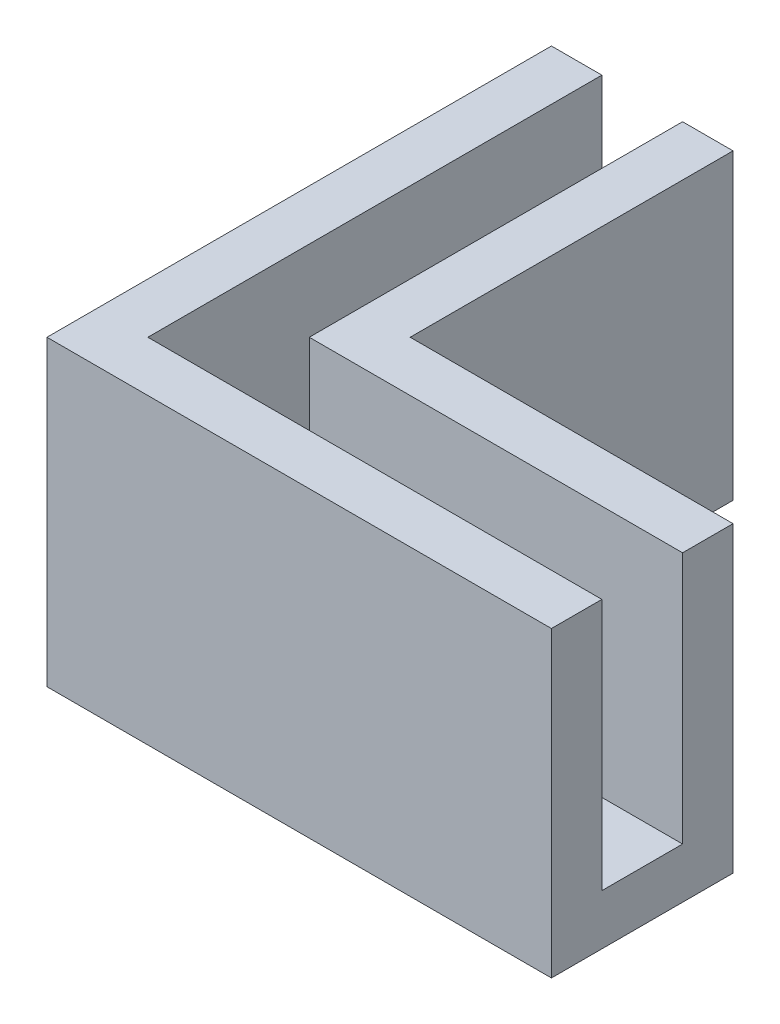
ISO-10303-21;
HEADER;
FILE_DESCRIPTION(('STEP AP214'),'2;1');
FILE_NAME('part.step','',(''),(''),'','','');
FILE_SCHEMA(('AUTOMOTIVE_DESIGN { 1 0 10303 214 1 1 1 1 }'));
ENDSEC;
DATA;
#1=APPLICATION_CONTEXT('core data for automotive mechanical design processes');
#2=APPLICATION_PROTOCOL_DEFINITION('international standard','automotive_design',2000,#1);
#3=PRODUCT_CONTEXT('',#1,'mechanical');
#4=PRODUCT('Part','Part','',(#3));
#5=PRODUCT_RELATED_PRODUCT_CATEGORY('part','',(#4));
#6=PRODUCT_DEFINITION_FORMATION('','',#4);
#7=PRODUCT_DEFINITION_CONTEXT('part definition',#1,'design');
#8=PRODUCT_DEFINITION('design','',#6,#7);
#9=PRODUCT_DEFINITION_SHAPE('','',#8);
#10=(LENGTH_UNIT() NAMED_UNIT(*) SI_UNIT(.MILLI.,.METRE.));
#11=(NAMED_UNIT(*) PLANE_ANGLE_UNIT() SI_UNIT($,.RADIAN.));
#12=(NAMED_UNIT(*) SI_UNIT($,.STERADIAN.) SOLID_ANGLE_UNIT());
#13=UNCERTAINTY_MEASURE_WITH_UNIT(LENGTH_MEASURE(1.E-05),#10,'distance_accuracy_value','');
#14=(GEOMETRIC_REPRESENTATION_CONTEXT(3) GLOBAL_UNCERTAINTY_ASSIGNED_CONTEXT((#13)) GLOBAL_UNIT_ASSIGNED_CONTEXT((#10,
#11,#12)) REPRESENTATION_CONTEXT('',''));
#15=CARTESIAN_POINT('',(0.,0.,0.));
#16=DIRECTION('',(0.,0.,1.));
#17=DIRECTION('',(1.,0.,0.));
#18=AXIS2_PLACEMENT_3D('',#15,#16,#17);
#19=CARTESIAN_POINT('',(50.,5.,1.5419764230905E-13));
#20=DIRECTION('',(-1.,0.,0.));
#21=DIRECTION('',(0.,0.,1.));
#22=AXIS2_PLACEMENT_3D('',#19,#20,#21);
#23=PLANE('',#22);
#24=DIRECTION('',(0.,0.,-1.));
#25=VECTOR('',#24,1.);
#26=CARTESIAN_POINT('',(50.,0.,1.5419764230905E-13));
#27=LINE('',#26,#25);
#28=CARTESIAN_POINT('',(50.,0.,1.66533452958502E-13));
#29=VERTEX_POINT('',#28);
#30=CARTESIAN_POINT('',(50.0000000000001,0.,-17.9999999999998));
#31=VERTEX_POINT('',#30);
#32=EDGE_CURVE('E249',#29,#31,#27,.T.);
#33=ORIENTED_EDGE('',*,*,#32,.T.);
#34=DIRECTION('',(0.,-1.,0.));
#35=VECTOR('',#34,1.);
#36=CARTESIAN_POINT('',(50.0000000000001,30.,-17.9999999999998));
#37=LINE('',#36,#35);
#38=CARTESIAN_POINT('',(50.0000000000001,30.,-17.9999999999998));
#39=VERTEX_POINT('',#38);
#40=EDGE_CURVE('E176',#39,#31,#37,.T.);
#41=ORIENTED_EDGE('',*,*,#40,.F.);
#42=DIRECTION('',(0.,0.,-1.));
#43=VECTOR('',#42,1.);
#44=CARTESIAN_POINT('',(50.,30.,1.5419764230905E-13));
#45=LINE('',#44,#43);
#46=CARTESIAN_POINT('',(50.,30.,-12.9999999999999));
#47=VERTEX_POINT('',#46);
#48=EDGE_CURVE('E179',#47,#39,#45,.T.);
#49=ORIENTED_EDGE('',*,*,#48,.F.);
#50=DIRECTION('',(0.,-1.,0.));
#51=VECTOR('',#50,1.);
#52=CARTESIAN_POINT('',(50.,30.,-12.9999999999999));
#53=LINE('',#52,#51);
#54=CARTESIAN_POINT('',(50.,5.,-12.9999999999999));
#55=VERTEX_POINT('',#54);
#56=EDGE_CURVE('E164',#47,#55,#53,.T.);
#57=ORIENTED_EDGE('',*,*,#56,.T.);
#58=DIRECTION('',(0.,0.,-1.));
#59=VECTOR('',#58,1.);
#60=CARTESIAN_POINT('',(50.,5.,1.5419764230905E-13));
#61=LINE('',#60,#59);
#62=CARTESIAN_POINT('',(50.,5.,-4.99999999999991));
#63=VERTEX_POINT('',#62);
#64=EDGE_CURVE('E253',#63,#55,#61,.T.);
#65=ORIENTED_EDGE('',*,*,#64,.F.);
#66=DIRECTION('',(0.,-1.,0.));
#67=VECTOR('',#66,1.);
#68=CARTESIAN_POINT('',(50.,30.,-4.99999999999991));
#69=LINE('',#68,#67);
#70=CARTESIAN_POINT('',(50.,30.,-4.99999999999991));
#71=VERTEX_POINT('',#70);
#72=EDGE_CURVE('E91',#71,#63,#69,.T.);
#73=ORIENTED_EDGE('',*,*,#72,.F.);
#74=DIRECTION('',(0.,0.,-1.));
#75=VECTOR('',#74,1.);
#76=CARTESIAN_POINT('',(50.,30.,1.5419764230905E-13));
#77=LINE('',#76,#75);
#78=CARTESIAN_POINT('',(50.,30.,1.66533452958502E-13));
#79=VERTEX_POINT('',#78);
#80=EDGE_CURVE('E229',#79,#71,#77,.T.);
#81=ORIENTED_EDGE('',*,*,#80,.F.);
#82=DIRECTION('',(0.,-1.,0.));
#83=VECTOR('',#82,1.);
#84=CARTESIAN_POINT('',(50.,30.,1.66533452958502E-13));
#85=LINE('',#84,#83);
#86=EDGE_CURVE('E236',#79,#29,#85,.T.);
#87=ORIENTED_EDGE('',*,*,#86,.T.);
#88=EDGE_LOOP('',(#33,#41,#49,#57,#65,#73,#81,#87));
#89=FACE_BOUND('',#88,.T.);
#90=ADVANCED_FACE('F75',(#89),#23,.F.);
#91=CARTESIAN_POINT('',(0.,5.,-50.));
#92=DIRECTION('',(0.,0.,-1.));
#93=DIRECTION('',(-1.,0.,0.));
#94=AXIS2_PLACEMENT_3D('',#91,#92,#93);
#95=PLANE('',#94);
#96=DIRECTION('',(1.,0.,0.));
#97=VECTOR('',#96,1.);
#98=CARTESIAN_POINT('',(0.,0.,-50.));
#99=LINE('',#98,#97);
#100=CARTESIAN_POINT('',(0.,0.,-50.));
#101=VERTEX_POINT('',#100);
#102=CARTESIAN_POINT('',(18.,0.,-50.));
#103=VERTEX_POINT('',#102);
#104=EDGE_CURVE('E78',#101,#103,#99,.T.);
#105=ORIENTED_EDGE('',*,*,#104,.F.);
#106=DIRECTION('',(0.,-1.,0.));
#107=VECTOR('',#106,1.);
#108=CARTESIAN_POINT('',(0.,30.,-50.));
#109=LINE('',#108,#107);
#110=CARTESIAN_POINT('',(0.,30.,-50.));
#111=VERTEX_POINT('',#110);
#112=EDGE_CURVE('E241',#111,#101,#109,.T.);
#113=ORIENTED_EDGE('',*,*,#112,.F.);
#114=DIRECTION('',(1.,0.,0.));
#115=VECTOR('',#114,1.);
#116=CARTESIAN_POINT('',(0.,30.,-50.));
#117=LINE('',#116,#115);
#118=CARTESIAN_POINT('',(5.,30.,-50.));
#119=VERTEX_POINT('',#118);
#120=EDGE_CURVE('E221',#111,#119,#117,.T.);
#121=ORIENTED_EDGE('',*,*,#120,.T.);
#122=DIRECTION('',(0.,-1.,0.));
#123=VECTOR('',#122,1.);
#124=CARTESIAN_POINT('',(5.,30.,-50.));
#125=LINE('',#124,#123);
#126=CARTESIAN_POINT('',(5.,5.,-50.));
#127=VERTEX_POINT('',#126);
#128=EDGE_CURVE('E244',#119,#127,#125,.T.);
#129=ORIENTED_EDGE('',*,*,#128,.T.);
#130=DIRECTION('',(1.,0.,0.));
#131=VECTOR('',#130,1.);
#132=CARTESIAN_POINT('',(0.,5.,-50.));
#133=LINE('',#132,#131);
#134=CARTESIAN_POINT('',(13.,5.,-50.));
#135=VERTEX_POINT('',#134);
#136=EDGE_CURVE('E12',#127,#135,#133,.T.);
#137=ORIENTED_EDGE('',*,*,#136,.T.);
#138=DIRECTION('',(0.,-1.,0.));
#139=VECTOR('',#138,1.);
#140=CARTESIAN_POINT('',(13.,30.,-50.));
#141=LINE('',#140,#139);
#142=CARTESIAN_POINT('',(13.,30.,-50.));
#143=VERTEX_POINT('',#142);
#144=EDGE_CURVE('E208',#143,#135,#141,.T.);
#145=ORIENTED_EDGE('',*,*,#144,.F.);
#146=DIRECTION('',(1.,0.,0.));
#147=VECTOR('',#146,1.);
#148=CARTESIAN_POINT('',(0.,30.,-50.));
#149=LINE('',#148,#147);
#150=CARTESIAN_POINT('',(18.,30.,-50.));
#151=VERTEX_POINT('',#150);
#152=EDGE_CURVE('E200',#143,#151,#149,.T.);
#153=ORIENTED_EDGE('',*,*,#152,.T.);
#154=DIRECTION('',(0.,-1.,0.));
#155=VECTOR('',#154,1.);
#156=CARTESIAN_POINT('',(18.,30.,-50.));
#157=LINE('',#156,#155);
#158=EDGE_CURVE('E210',#151,#103,#157,.T.);
#159=ORIENTED_EDGE('',*,*,#158,.T.);
#160=EDGE_LOOP('',(#105,#113,#121,#129,#137,#145,#153,#159));
#161=FACE_BOUND('',#160,.T.);
#162=ADVANCED_FACE('F263',(#161),#95,.T.);
#163=CARTESIAN_POINT('',(0.,5.,0.));
#164=DIRECTION('',(0.,1.,0.));
#165=DIRECTION('',(0.,0.,1.));
#166=AXIS2_PLACEMENT_3D('',#163,#164,#165);
#167=PLANE('',#166);
#168=DIRECTION('',(0.,0.,-1.));
#169=VECTOR('',#168,1.);
#170=CARTESIAN_POINT('',(5.,5.,0.));
#171=LINE('',#170,#169);
#172=CARTESIAN_POINT('',(5.,5.,-4.99999999999998));
#173=VERTEX_POINT('',#172);
#174=EDGE_CURVE('E250',#173,#127,#171,.T.);
#175=ORIENTED_EDGE('',*,*,#174,.F.);
#176=DIRECTION('',(1.,0.,0.));
#177=VECTOR('',#176,1.);
#178=CARTESIAN_POINT('',(0.,5.,-5.));
#179=LINE('',#178,#177);
#180=EDGE_CURVE('E95',#173,#63,#179,.T.);
#181=ORIENTED_EDGE('',*,*,#180,.T.);
#182=ORIENTED_EDGE('',*,*,#64,.T.);
#183=DIRECTION('',(-1.,0.,0.));
#184=VECTOR('',#183,1.);
#185=CARTESIAN_POINT('',(0.,5.,-13.));
#186=LINE('',#185,#184);
#187=CARTESIAN_POINT('',(13.,5.,-13.));
#188=VERTEX_POINT('',#187);
#189=EDGE_CURVE('E171',#55,#188,#186,.T.);
#190=ORIENTED_EDGE('',*,*,#189,.T.);
#191=DIRECTION('',(0.,0.,1.));
#192=VECTOR('',#191,1.);
#193=CARTESIAN_POINT('',(13.,5.,0.));
#194=LINE('',#193,#192);
#195=EDGE_CURVE('E83',#135,#188,#194,.T.);
#196=ORIENTED_EDGE('',*,*,#195,.F.);
#197=ORIENTED_EDGE('',*,*,#136,.F.);
#198=EDGE_LOOP('',(#175,#181,#182,#190,#196,#197));
#199=FACE_BOUND('',#198,.T.);
#200=ADVANCED_FACE('F289',(#199),#167,.T.);
#201=CARTESIAN_POINT('',(0.,0.,0.));
#202=DIRECTION('',(0.,1.,0.));
#203=DIRECTION('',(0.,0.,1.));
#204=AXIS2_PLACEMENT_3D('',#201,#202,#203);
#205=PLANE('',#204);
#206=ORIENTED_EDGE('',*,*,#32,.F.);
#207=DIRECTION('',(1.,0.,0.));
#208=VECTOR('',#207,1.);
#209=CARTESIAN_POINT('',(0.,0.,0.));
#210=LINE('',#209,#208);
#211=CARTESIAN_POINT('',(0.,0.,0.));
#212=VERTEX_POINT('',#211);
#213=EDGE_CURVE('E219',#212,#29,#210,.T.);
#214=ORIENTED_EDGE('',*,*,#213,.F.);
#215=DIRECTION('',(0.,0.,-1.));
#216=VECTOR('',#215,1.);
#217=CARTESIAN_POINT('',(0.,0.,0.));
#218=LINE('',#217,#216);
#219=EDGE_CURVE('E175',#212,#101,#218,.T.);
#220=ORIENTED_EDGE('',*,*,#219,.T.);
#221=ORIENTED_EDGE('',*,*,#104,.T.);
#222=DIRECTION('',(0.,0.,1.));
#223=VECTOR('',#222,1.);
#224=CARTESIAN_POINT('',(18.,0.,0.));
#225=LINE('',#224,#223);
#226=CARTESIAN_POINT('',(18.,0.,-17.9999999999999));
#227=VERTEX_POINT('',#226);
#228=EDGE_CURVE('E190',#103,#227,#225,.T.);
#229=ORIENTED_EDGE('',*,*,#228,.T.);
#230=DIRECTION('',(-1.,0.,0.));
#231=VECTOR('',#230,1.);
#232=CARTESIAN_POINT('',(0.,0.,-18.));
#233=LINE('',#232,#231);
#234=EDGE_CURVE('E193',#31,#227,#233,.T.);
#235=ORIENTED_EDGE('',*,*,#234,.F.);
#236=EDGE_LOOP('',(#206,#214,#220,#221,#229,#235));
#237=FACE_BOUND('',#236,.T.);
#238=ADVANCED_FACE('F257',(#237),#205,.F.);
#239=CARTESIAN_POINT('',(0.,30.,-5.));
#240=DIRECTION('',(0.,0.,-1.));
#241=DIRECTION('',(-1.,0.,0.));
#242=AXIS2_PLACEMENT_3D('',#239,#240,#241);
#243=PLANE('',#242);
#244=ORIENTED_EDGE('',*,*,#72,.T.);
#245=ORIENTED_EDGE('',*,*,#180,.F.);
#246=DIRECTION('',(0.,-1.,0.));
#247=VECTOR('',#246,1.);
#248=CARTESIAN_POINT('',(5.,30.,-4.99999999999998));
#249=LINE('',#248,#247);
#250=CARTESIAN_POINT('',(5.,30.,-4.99999999999998));
#251=VERTEX_POINT('',#250);
#252=EDGE_CURVE('E247',#251,#173,#249,.T.);
#253=ORIENTED_EDGE('',*,*,#252,.F.);
#254=DIRECTION('',(1.,0.,0.));
#255=VECTOR('',#254,1.);
#256=CARTESIAN_POINT('',(0.,30.,-5.));
#257=LINE('',#256,#255);
#258=EDGE_CURVE('E216',#251,#71,#257,.T.);
#259=ORIENTED_EDGE('',*,*,#258,.T.);
#260=EDGE_LOOP('',(#244,#245,#253,#259));
#261=FACE_BOUND('',#260,.T.);
#262=ADVANCED_FACE('F310',(#261),#243,.T.);
#263=CARTESIAN_POINT('',(5.,30.,0.));
#264=DIRECTION('',(-1.,0.,0.));
#265=DIRECTION('',(0.,0.,1.));
#266=AXIS2_PLACEMENT_3D('',#263,#264,#265);
#267=PLANE('',#266);
#268=ORIENTED_EDGE('',*,*,#174,.T.);
#269=ORIENTED_EDGE('',*,*,#128,.F.);
#270=DIRECTION('',(0.,0.,-1.));
#271=VECTOR('',#270,1.);
#272=CARTESIAN_POINT('',(5.,30.,0.));
#273=LINE('',#272,#271);
#274=EDGE_CURVE('E218',#251,#119,#273,.T.);
#275=ORIENTED_EDGE('',*,*,#274,.F.);
#276=ORIENTED_EDGE('',*,*,#252,.T.);
#277=EDGE_LOOP('',(#268,#269,#275,#276));
#278=FACE_BOUND('',#277,.T.);
#279=ADVANCED_FACE('F314',(#278),#267,.F.);
#280=CARTESIAN_POINT('',(0.,30.,0.));
#281=DIRECTION('',(-1.,0.,0.));
#282=DIRECTION('',(0.,0.,1.));
#283=AXIS2_PLACEMENT_3D('',#280,#281,#282);
#284=PLANE('',#283);
#285=ORIENTED_EDGE('',*,*,#219,.F.);
#286=DIRECTION('',(0.,-1.,0.));
#287=VECTOR('',#286,1.);
#288=CARTESIAN_POINT('',(0.,30.,0.));
#289=LINE('',#288,#287);
#290=CARTESIAN_POINT('',(0.,30.,0.));
#291=VERTEX_POINT('',#290);
#292=EDGE_CURVE('E239',#291,#212,#289,.T.);
#293=ORIENTED_EDGE('',*,*,#292,.F.);
#294=DIRECTION('',(0.,0.,-1.));
#295=VECTOR('',#294,1.);
#296=CARTESIAN_POINT('',(0.,30.,0.));
#297=LINE('',#296,#295);
#298=EDGE_CURVE('E224',#291,#111,#297,.T.);
#299=ORIENTED_EDGE('',*,*,#298,.T.);
#300=ORIENTED_EDGE('',*,*,#112,.T.);
#301=EDGE_LOOP('',(#285,#293,#299,#300));
#302=FACE_BOUND('',#301,.T.);
#303=ADVANCED_FACE('F281',(#302),#284,.T.);
#304=CARTESIAN_POINT('',(0.,30.,0.));
#305=DIRECTION('',(0.,0.,-1.));
#306=DIRECTION('',(-1.,0.,0.));
#307=AXIS2_PLACEMENT_3D('',#304,#305,#306);
#308=PLANE('',#307);
#309=ORIENTED_EDGE('',*,*,#213,.T.);
#310=ORIENTED_EDGE('',*,*,#86,.F.);
#311=DIRECTION('',(1.,0.,0.));
#312=VECTOR('',#311,1.);
#313=CARTESIAN_POINT('',(0.,30.,0.));
#314=LINE('',#313,#312);
#315=EDGE_CURVE('E227',#291,#79,#314,.T.);
#316=ORIENTED_EDGE('',*,*,#315,.F.);
#317=ORIENTED_EDGE('',*,*,#292,.T.);
#318=EDGE_LOOP('',(#309,#310,#316,#317));
#319=FACE_BOUND('',#318,.T.);
#320=ADVANCED_FACE('F272',(#319),#308,.F.);
#321=CARTESIAN_POINT('',(0.,30.,0.));
#322=DIRECTION('',(0.,1.,0.));
#323=DIRECTION('',(0.,0.,1.));
#324=AXIS2_PLACEMENT_3D('',#321,#322,#323);
#325=PLANE('',#324);
#326=ORIENTED_EDGE('',*,*,#258,.F.);
#327=ORIENTED_EDGE('',*,*,#274,.T.);
#328=ORIENTED_EDGE('',*,*,#120,.F.);
#329=ORIENTED_EDGE('',*,*,#298,.F.);
#330=ORIENTED_EDGE('',*,*,#315,.T.);
#331=ORIENTED_EDGE('',*,*,#80,.T.);
#332=EDGE_LOOP('',(#326,#327,#328,#329,#330,#331));
#333=FACE_BOUND('',#332,.T.);
#334=ADVANCED_FACE('F277',(#333),#325,.T.);
#335=CARTESIAN_POINT('',(0.,30.,-13.));
#336=DIRECTION('',(0.,0.,1.));
#337=DIRECTION('',(1.,0.,0.));
#338=AXIS2_PLACEMENT_3D('',#335,#336,#337);
#339=PLANE('',#338);
#340=DIRECTION('',(0.,-1.,0.));
#341=VECTOR('',#340,1.);
#342=CARTESIAN_POINT('',(13.,30.,-13.));
#343=LINE('',#342,#341);
#344=CARTESIAN_POINT('',(13.,30.,-13.));
#345=VERTEX_POINT('',#344);
#346=EDGE_CURVE('E204',#345,#188,#343,.T.);
#347=ORIENTED_EDGE('',*,*,#346,.T.);
#348=ORIENTED_EDGE('',*,*,#189,.F.);
#349=ORIENTED_EDGE('',*,*,#56,.F.);
#350=DIRECTION('',(-1.,0.,0.));
#351=VECTOR('',#350,1.);
#352=CARTESIAN_POINT('',(0.,30.,-13.));
#353=LINE('',#352,#351);
#354=EDGE_CURVE('E169',#47,#345,#353,.T.);
#355=ORIENTED_EDGE('',*,*,#354,.T.);
#356=EDGE_LOOP('',(#347,#348,#349,#355));
#357=FACE_BOUND('',#356,.T.);
#358=ADVANCED_FACE('F167',(#357),#339,.T.);
#359=CARTESIAN_POINT('',(0.,30.,-18.));
#360=DIRECTION('',(0.,0.,1.));
#361=DIRECTION('',(1.,0.,0.));
#362=AXIS2_PLACEMENT_3D('',#359,#360,#361);
#363=PLANE('',#362);
#364=ORIENTED_EDGE('',*,*,#234,.T.);
#365=DIRECTION('',(0.,-1.,0.));
#366=VECTOR('',#365,1.);
#367=CARTESIAN_POINT('',(18.,30.,-17.9999999999999));
#368=LINE('',#367,#366);
#369=CARTESIAN_POINT('',(18.,30.,-17.9999999999999));
#370=VERTEX_POINT('',#369);
#371=EDGE_CURVE('E213',#370,#227,#368,.T.);
#372=ORIENTED_EDGE('',*,*,#371,.F.);
#373=DIRECTION('',(-1.,0.,0.));
#374=VECTOR('',#373,1.);
#375=CARTESIAN_POINT('',(0.,30.,-18.));
#376=LINE('',#375,#374);
#377=EDGE_CURVE('E183',#39,#370,#376,.T.);
#378=ORIENTED_EDGE('',*,*,#377,.F.);
#379=ORIENTED_EDGE('',*,*,#40,.T.);
#380=EDGE_LOOP('',(#364,#372,#378,#379));
#381=FACE_BOUND('',#380,.T.);
#382=ADVANCED_FACE('F269',(#381),#363,.F.);
#383=CARTESIAN_POINT('',(18.,30.,0.));
#384=DIRECTION('',(1.,0.,0.));
#385=DIRECTION('',(0.,0.,-1.));
#386=AXIS2_PLACEMENT_3D('',#383,#384,#385);
#387=PLANE('',#386);
#388=ORIENTED_EDGE('',*,*,#228,.F.);
#389=ORIENTED_EDGE('',*,*,#158,.F.);
#390=DIRECTION('',(0.,0.,1.));
#391=VECTOR('',#390,1.);
#392=CARTESIAN_POINT('',(18.,30.,0.));
#393=LINE('',#392,#391);
#394=EDGE_CURVE('E197',#151,#370,#393,.T.);
#395=ORIENTED_EDGE('',*,*,#394,.T.);
#396=ORIENTED_EDGE('',*,*,#371,.T.);
#397=EDGE_LOOP('',(#388,#389,#395,#396));
#398=FACE_BOUND('',#397,.T.);
#399=ADVANCED_FACE('F266',(#398),#387,.T.);
#400=CARTESIAN_POINT('',(13.,30.,0.));
#401=DIRECTION('',(1.,0.,0.));
#402=DIRECTION('',(0.,0.,-1.));
#403=AXIS2_PLACEMENT_3D('',#400,#401,#402);
#404=PLANE('',#403);
#405=ORIENTED_EDGE('',*,*,#195,.T.);
#406=ORIENTED_EDGE('',*,*,#346,.F.);
#407=DIRECTION('',(0.,0.,1.));
#408=VECTOR('',#407,1.);
#409=CARTESIAN_POINT('',(13.,30.,0.));
#410=LINE('',#409,#408);
#411=EDGE_CURVE('E188',#143,#345,#410,.T.);
#412=ORIENTED_EDGE('',*,*,#411,.F.);
#413=ORIENTED_EDGE('',*,*,#144,.T.);
#414=EDGE_LOOP('',(#405,#406,#412,#413));
#415=FACE_BOUND('',#414,.T.);
#416=ADVANCED_FACE('F291',(#415),#404,.F.);
#417=CARTESIAN_POINT('',(0.,30.,0.));
#418=DIRECTION('',(0.,1.,0.));
#419=DIRECTION('',(0.,0.,1.));
#420=AXIS2_PLACEMENT_3D('',#417,#418,#419);
#421=PLANE('',#420);
#422=ORIENTED_EDGE('',*,*,#354,.F.);
#423=ORIENTED_EDGE('',*,*,#48,.T.);
#424=ORIENTED_EDGE('',*,*,#377,.T.);
#425=ORIENTED_EDGE('',*,*,#394,.F.);
#426=ORIENTED_EDGE('',*,*,#152,.F.);
#427=ORIENTED_EDGE('',*,*,#411,.T.);
#428=EDGE_LOOP('',(#422,#423,#424,#425,#426,#427));
#429=FACE_BOUND('',#428,.T.);
#430=ADVANCED_FACE('F185',(#429),#421,.T.);
#431=CLOSED_SHELL('',(#90,#162,#200,#238,#262,#279,#303,#320,#334,#358,#382,#399,#416,#430));
#432=MANIFOLD_SOLID_BREP('B2',#431);
#433=ADVANCED_BREP_SHAPE_REPRESENTATION('',(#18,#432),#14);
#434=SHAPE_DEFINITION_REPRESENTATION(#9,#433);
ENDSEC;
END-ISO-10303-21;
